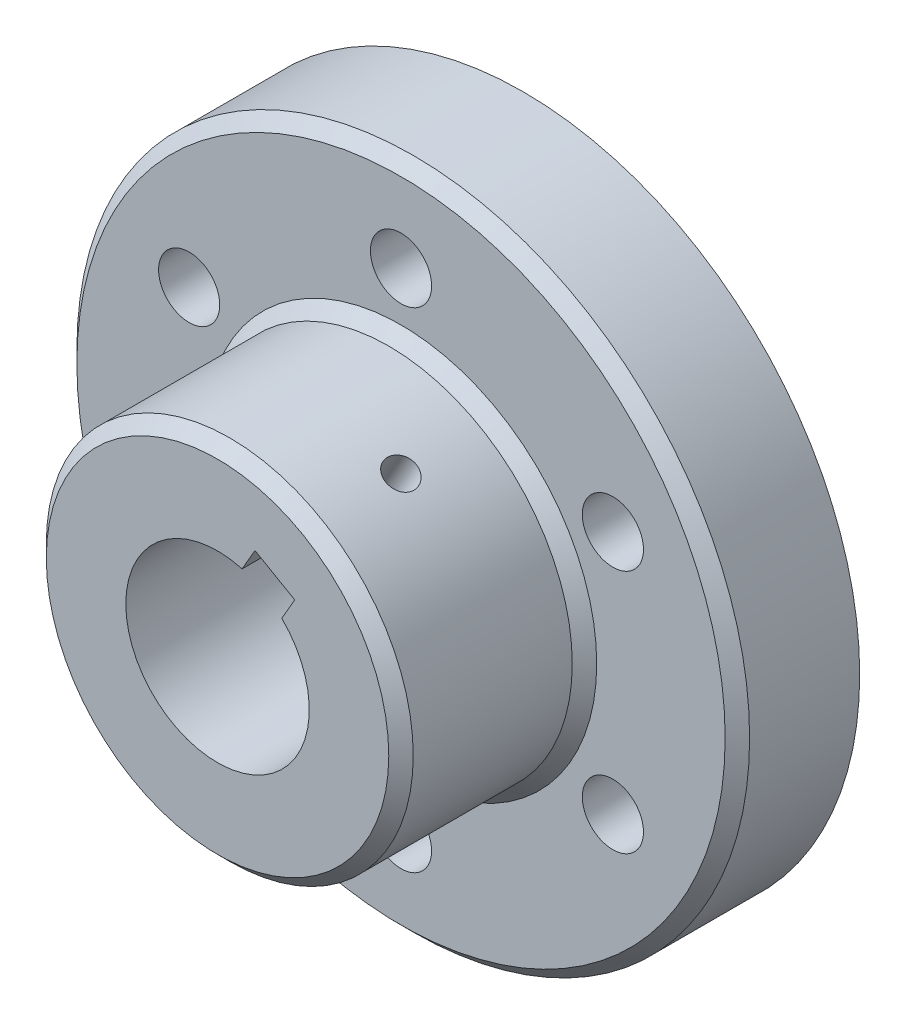
ISO-10303-21;
HEADER;
FILE_DESCRIPTION(('STEP AP214'),'2;1');
FILE_NAME('part.step','',(''),(''),'','','');
FILE_SCHEMA(('AUTOMOTIVE_DESIGN { 1 0 10303 214 1 1 1 1 }'));
ENDSEC;
DATA;
#1=APPLICATION_CONTEXT('core data for automotive mechanical design processes');
#2=APPLICATION_PROTOCOL_DEFINITION('international standard','automotive_design',2000,#1);
#3=PRODUCT_CONTEXT('',#1,'mechanical');
#4=PRODUCT('Part','Part','',(#3));
#5=PRODUCT_RELATED_PRODUCT_CATEGORY('part','',(#4));
#6=PRODUCT_DEFINITION_FORMATION('','',#4);
#7=PRODUCT_DEFINITION_CONTEXT('part definition',#1,'design');
#8=PRODUCT_DEFINITION('design','',#6,#7);
#9=PRODUCT_DEFINITION_SHAPE('','',#8);
#10=(LENGTH_UNIT() NAMED_UNIT(*) SI_UNIT(.MILLI.,.METRE.));
#11=(NAMED_UNIT(*) PLANE_ANGLE_UNIT() SI_UNIT($,.RADIAN.));
#12=(NAMED_UNIT(*) SI_UNIT($,.STERADIAN.) SOLID_ANGLE_UNIT());
#13=UNCERTAINTY_MEASURE_WITH_UNIT(LENGTH_MEASURE(1.E-05),#10,'distance_accuracy_value','');
#14=(GEOMETRIC_REPRESENTATION_CONTEXT(3) GLOBAL_UNCERTAINTY_ASSIGNED_CONTEXT((#13)) GLOBAL_UNIT_ASSIGNED_CONTEXT((#10,
#11,#12)) REPRESENTATION_CONTEXT('',''));
#15=CARTESIAN_POINT('',(0.,0.,0.));
#16=DIRECTION('',(0.,0.,1.));
#17=DIRECTION('',(1.,0.,0.));
#18=AXIS2_PLACEMENT_3D('',#15,#16,#17);
#19=CARTESIAN_POINT('',(0.,0.,12.7));
#20=DIRECTION('',(0.,0.,1.));
#21=DIRECTION('',(1.,0.,0.));
#22=AXIS2_PLACEMENT_3D('',#19,#20,#21);
#23=PLANE('',#22);
#24=CARTESIAN_POINT('',(0.,0.,12.7));
#25=DIRECTION('',(0.,0.,1.));
#26=DIRECTION('',(1.,0.,0.));
#27=AXIS2_PLACEMENT_3D('',#24,#25,#26);
#28=CIRCLE('',#27,20.32);
#29=CARTESIAN_POINT('',(-20.32,0.,12.7));
#30=VERTEX_POINT('',#29);
#31=EDGE_CURVE('E166',#30,#30,#28,.F.);
#32=ORIENTED_EDGE('',*,*,#31,.T.);
#33=EDGE_LOOP('',(#32));
#34=FACE_BOUND('',#33,.T.);
#35=CARTESIAN_POINT('',(0.,0.,12.7));
#36=DIRECTION('',(0.,0.,1.));
#37=DIRECTION('',(1.,0.,0.));
#38=AXIS2_PLACEMENT_3D('',#35,#36,#37);
#39=CIRCLE('',#38,33.655);
#40=CARTESIAN_POINT('',(33.655,0.,12.7));
#41=VERTEX_POINT('',#40);
#42=EDGE_CURVE('E163',#41,#41,#39,.T.);
#43=ORIENTED_EDGE('',*,*,#42,.T.);
#44=EDGE_LOOP('',(#43));
#45=FACE_BOUND('',#44,.T.);
#46=CARTESIAN_POINT('',(-21.9970452561246,12.7000000000003,12.7));
#47=DIRECTION('',(0.,0.,1.));
#48=DIRECTION('',(1.,0.,0.));
#49=AXIS2_PLACEMENT_3D('',#46,#47,#48);
#50=CIRCLE('',#49,3.175);
#51=CARTESIAN_POINT('',(-18.8220452561246,12.7000000000003,12.7));
#52=VERTEX_POINT('',#51);
#53=EDGE_CURVE('E114',#52,#52,#50,.T.);
#54=ORIENTED_EDGE('',*,*,#53,.F.);
#55=EDGE_LOOP('',(#54));
#56=FACE_BOUND('',#55,.T.);
#57=CARTESIAN_POINT('',(-21.9970452561249,-12.6999999999998,12.7));
#58=DIRECTION('',(0.,0.,1.));
#59=DIRECTION('',(1.,0.,0.));
#60=AXIS2_PLACEMENT_3D('',#57,#58,#59);
#61=CIRCLE('',#60,3.175);
#62=CARTESIAN_POINT('',(-18.8220452561249,-12.6999999999998,12.7));
#63=VERTEX_POINT('',#62);
#64=EDGE_CURVE('E120',#63,#63,#61,.T.);
#65=ORIENTED_EDGE('',*,*,#64,.F.);
#66=EDGE_LOOP('',(#65));
#67=FACE_BOUND('',#66,.T.);
#68=CARTESIAN_POINT('',(-1.77367252013231E-13,-25.4,12.7));
#69=DIRECTION('',(0.,0.,1.));
#70=DIRECTION('',(1.,0.,0.));
#71=AXIS2_PLACEMENT_3D('',#68,#69,#70);
#72=CIRCLE('',#71,3.175);
#73=CARTESIAN_POINT('',(3.17499999999982,-25.4,12.7));
#74=VERTEX_POINT('',#73);
#75=EDGE_CURVE('E126',#74,#74,#72,.T.);
#76=ORIENTED_EDGE('',*,*,#75,.F.);
#77=EDGE_LOOP('',(#76));
#78=FACE_BOUND('',#77,.T.);
#79=CARTESIAN_POINT('',(21.9970452561247,-12.7000000000001,12.7));
#80=DIRECTION('',(0.,0.,1.));
#81=DIRECTION('',(1.,0.,0.));
#82=AXIS2_PLACEMENT_3D('',#79,#80,#81);
#83=CIRCLE('',#82,3.175);
#84=CARTESIAN_POINT('',(25.1720452561247,-12.7000000000001,12.7));
#85=VERTEX_POINT('',#84);
#86=EDGE_CURVE('E132',#85,#85,#83,.T.);
#87=ORIENTED_EDGE('',*,*,#86,.F.);
#88=EDGE_LOOP('',(#87));
#89=FACE_BOUND('',#88,.T.);
#90=CARTESIAN_POINT('',(21.9970452561248,12.6999999999999,12.7));
#91=DIRECTION('',(0.,0.,1.));
#92=DIRECTION('',(1.,0.,0.));
#93=AXIS2_PLACEMENT_3D('',#90,#91,#92);
#94=CIRCLE('',#93,3.175);
#95=CARTESIAN_POINT('',(25.1720452561248,12.6999999999999,12.7));
#96=VERTEX_POINT('',#95);
#97=EDGE_CURVE('E138',#96,#96,#94,.T.);
#98=ORIENTED_EDGE('',*,*,#97,.F.);
#99=EDGE_LOOP('',(#98));
#100=FACE_BOUND('',#99,.T.);
#101=CARTESIAN_POINT('',(0.,25.4,12.7));
#102=DIRECTION('',(0.,0.,1.));
#103=DIRECTION('',(1.,0.,0.));
#104=AXIS2_PLACEMENT_3D('',#101,#102,#103);
#105=CIRCLE('',#104,3.175);
#106=CARTESIAN_POINT('',(3.175,25.4,12.7));
#107=VERTEX_POINT('',#106);
#108=EDGE_CURVE('E148',#107,#107,#105,.T.);
#109=ORIENTED_EDGE('',*,*,#108,.F.);
#110=EDGE_LOOP('',(#109));
#111=FACE_BOUND('',#110,.T.);
#112=ADVANCED_FACE('F33',(#34,#45,#56,#67,#78,#89,#100,#111),#23,.T.);
#113=CARTESIAN_POINT('',(0.,0.,12.7));
#114=DIRECTION('',(0.,0.,-1.));
#115=DIRECTION('',(-1.,0.,0.));
#116=AXIS2_PLACEMENT_3D('',#113,#114,#115);
#117=CYLINDRICAL_SURFACE('',#116,34.925);
#118=CARTESIAN_POINT('',(0.,0.,11.43));
#119=DIRECTION('',(0.,0.,1.));
#120=DIRECTION('',(1.,0.,0.));
#121=AXIS2_PLACEMENT_3D('',#118,#119,#120);
#122=CIRCLE('',#121,34.925);
#123=CARTESIAN_POINT('',(34.925,0.,11.43));
#124=VERTEX_POINT('',#123);
#125=EDGE_CURVE('E11',#124,#124,#122,.F.);
#126=ORIENTED_EDGE('',*,*,#125,.T.);
#127=EDGE_LOOP('',(#126));
#128=FACE_BOUND('',#127,.T.);
#129=CARTESIAN_POINT('',(0.,0.,0.));
#130=DIRECTION('',(0.,0.,1.));
#131=DIRECTION('',(1.,0.,0.));
#132=AXIS2_PLACEMENT_3D('',#129,#130,#131);
#133=CIRCLE('',#132,34.925);
#134=CARTESIAN_POINT('',(34.925,0.,0.));
#135=VERTEX_POINT('',#134);
#136=EDGE_CURVE('E151',#135,#135,#133,.T.);
#137=ORIENTED_EDGE('',*,*,#136,.T.);
#138=EDGE_LOOP('',(#137));
#139=FACE_BOUND('',#138,.T.);
#140=ADVANCED_FACE('F186',(#128,#139),#117,.T.);
#141=CARTESIAN_POINT('',(0.,0.,0.));
#142=DIRECTION('',(0.,0.,1.));
#143=DIRECTION('',(1.,0.,0.));
#144=AXIS2_PLACEMENT_3D('',#141,#142,#143);
#145=PLANE('',#144);
#146=CARTESIAN_POINT('',(-21.9970452561246,12.7000000000003,0.));
#147=DIRECTION('',(0.,0.,-1.));
#148=DIRECTION('',(-0.50000000000001,-0.866025403784433,0.));
#149=AXIS2_PLACEMENT_3D('',#146,#147,#148);
#150=CIRCLE('',#149,3.175);
#151=CARTESIAN_POINT('',(-23.5845452561246,9.95036934298468,0.));
#152=VERTEX_POINT('',#151);
#153=EDGE_CURVE('E110',#152,#152,#150,.T.);
#154=ORIENTED_EDGE('',*,*,#153,.F.);
#155=EDGE_LOOP('',(#154));
#156=FACE_BOUND('',#155,.T.);
#157=CARTESIAN_POINT('',(-21.9970452561249,-12.6999999999998,0.));
#158=DIRECTION('',(0.,0.,-1.));
#159=DIRECTION('',(0.499999999999992,-0.866025403784443,0.));
#160=AXIS2_PLACEMENT_3D('',#157,#158,#159);
#161=CIRCLE('',#160,3.175);
#162=CARTESIAN_POINT('',(-20.4095452561249,-15.4496306570154,0.));
#163=VERTEX_POINT('',#162);
#164=EDGE_CURVE('E117',#163,#163,#161,.T.);
#165=ORIENTED_EDGE('',*,*,#164,.F.);
#166=EDGE_LOOP('',(#165));
#167=FACE_BOUND('',#166,.T.);
#168=CARTESIAN_POINT('',(-1.77367252013231E-13,-25.4,0.));
#169=DIRECTION('',(0.,0.,-1.));
#170=DIRECTION('',(1.,0.,0.));
#171=AXIS2_PLACEMENT_3D('',#168,#169,#170);
#172=CIRCLE('',#171,3.175);
#173=CARTESIAN_POINT('',(3.17499999999982,-25.4,0.));
#174=VERTEX_POINT('',#173);
#175=EDGE_CURVE('E123',#174,#174,#172,.T.);
#176=ORIENTED_EDGE('',*,*,#175,.F.);
#177=EDGE_LOOP('',(#176));
#178=FACE_BOUND('',#177,.T.);
#179=CARTESIAN_POINT('',(21.9970452561247,-12.7000000000001,0.));
#180=DIRECTION('',(0.,0.,-1.));
#181=DIRECTION('',(0.500000000000004,0.866025403784436,0.));
#182=AXIS2_PLACEMENT_3D('',#179,#180,#181);
#183=CIRCLE('',#182,3.175);
#184=CARTESIAN_POINT('',(23.5845452561247,-9.95036934298452,0.));
#185=VERTEX_POINT('',#184);
#186=EDGE_CURVE('E129',#185,#185,#183,.T.);
#187=ORIENTED_EDGE('',*,*,#186,.F.);
#188=EDGE_LOOP('',(#187));
#189=FACE_BOUND('',#188,.T.);
#190=CARTESIAN_POINT('',(21.9970452561248,12.6999999999999,0.));
#191=DIRECTION('',(0.,0.,-1.));
#192=DIRECTION('',(-0.499999999999998,0.86602540378444,0.));
#193=AXIS2_PLACEMENT_3D('',#190,#191,#192);
#194=CIRCLE('',#193,3.175);
#195=CARTESIAN_POINT('',(20.4095452561248,15.4496306570155,0.));
#196=VERTEX_POINT('',#195);
#197=EDGE_CURVE('E135',#196,#196,#194,.T.);
#198=ORIENTED_EDGE('',*,*,#197,.F.);
#199=EDGE_LOOP('',(#198));
#200=FACE_BOUND('',#199,.T.);
#201=DIRECTION('',(0.86602540378444,-0.499999999999998,0.));
#202=VECTOR('',#201,1.);
#203=CARTESIAN_POINT('',(3.89090200723829,11.5017399638085,0.));
#204=LINE('',#203,#202);
#205=CARTESIAN_POINT('',(3.89090200723829,11.5017399638085,0.));
#206=VERTEX_POINT('',#205);
#207=CARTESIAN_POINT('',(8.01534799276168,9.12048996380849,0.));
#208=VERTEX_POINT('',#207);
#209=EDGE_CURVE('E96',#206,#208,#204,.T.);
#210=ORIENTED_EDGE('',*,*,#209,.F.);
#211=DIRECTION('',(0.499999999999999,0.866025403784439,0.));
#212=VECTOR('',#211,1.);
#213=CARTESIAN_POINT('',(1.50965200723829,7.37729397828509,0.));
#214=LINE('',#213,#212);
#215=CARTESIAN_POINT('',(2.54904780381649,9.17758030713206,0.));
#216=VERTEX_POINT('',#215);
#217=EDGE_CURVE('E79',#216,#206,#214,.T.);
#218=ORIENTED_EDGE('',*,*,#217,.F.);
#219=CARTESIAN_POINT('',(0.,0.,0.));
#220=DIRECTION('',(0.,0.,-1.));
#221=DIRECTION('',(-1.,0.,0.));
#222=AXIS2_PLACEMENT_3D('',#219,#220,#221);
#223=CIRCLE('',#222,9.525);
#224=CARTESIAN_POINT('',(6.67349378933989,6.79633030713207,0.));
#225=VERTEX_POINT('',#224);
#226=EDGE_CURVE('E141',#225,#216,#223,.T.);
#227=ORIENTED_EDGE('',*,*,#226,.F.);
#228=DIRECTION('',(-0.499999999999998,-0.86602540378444,0.));
#229=VECTOR('',#228,1.);
#230=CARTESIAN_POINT('',(5.63409799276169,4.99604397828509,0.));
#231=LINE('',#230,#229);
#232=EDGE_CURVE('E48',#208,#225,#231,.T.);
#233=ORIENTED_EDGE('',*,*,#232,.F.);
#234=EDGE_LOOP('',(#210,#218,#227,#233));
#235=FACE_BOUND('',#234,.T.);
#236=CARTESIAN_POINT('',(0.,25.4,0.));
#237=DIRECTION('',(0.,0.,-1.));
#238=DIRECTION('',(-1.,0.,0.));
#239=AXIS2_PLACEMENT_3D('',#236,#237,#238);
#240=CIRCLE('',#239,3.175);
#241=CARTESIAN_POINT('',(-3.175,25.4,0.));
#242=VERTEX_POINT('',#241);
#243=EDGE_CURVE('E143',#242,#242,#240,.T.);
#244=ORIENTED_EDGE('',*,*,#243,.F.);
#245=EDGE_LOOP('',(#244));
#246=FACE_BOUND('',#245,.T.);
#247=ORIENTED_EDGE('',*,*,#136,.F.);
#248=EDGE_LOOP('',(#247));
#249=FACE_BOUND('',#248,.T.);
#250=ADVANCED_FACE('F192',(#156,#167,#178,#189,#200,#235,#246,#249),#145,.F.);
#251=CARTESIAN_POINT('',(0.,0.,31.75));
#252=DIRECTION('',(0.,0.,-1.));
#253=DIRECTION('',(-1.,0.,0.));
#254=AXIS2_PLACEMENT_3D('',#251,#252,#253);
#255=CYLINDRICAL_SURFACE('',#254,19.05);
#256=CARTESIAN_POINT('',(0.,0.,13.9700000000001));
#257=DIRECTION('',(0.,0.,1.));
#258=DIRECTION('',(1.,0.,0.));
#259=AXIS2_PLACEMENT_3D('',#256,#257,#258);
#260=CIRCLE('',#259,19.05);
#261=CARTESIAN_POINT('',(-19.05,0.,13.9700000000001));
#262=VERTEX_POINT('',#261);
#263=EDGE_CURVE('E160',#262,#262,#260,.T.);
#264=ORIENTED_EDGE('',*,*,#263,.T.);
#265=EDGE_LOOP('',(#264));
#266=FACE_BOUND('',#265,.T.);
#267=CARTESIAN_POINT('',(0.,0.,30.4800000000001));
#268=DIRECTION('',(0.,0.,1.));
#269=DIRECTION('',(1.,0.,0.));
#270=AXIS2_PLACEMENT_3D('',#267,#268,#269);
#271=CIRCLE('',#270,19.05);
#272=CARTESIAN_POINT('',(19.05,0.,30.4800000000001));
#273=VERTEX_POINT('',#272);
#274=EDGE_CURVE('E157',#273,#273,#271,.F.);
#275=ORIENTED_EDGE('',*,*,#274,.T.);
#276=EDGE_LOOP('',(#275));
#277=FACE_BOUND('',#276,.T.);
#278=CARTESIAN_POINT('',(10.8666847933445,15.6466501719088,22.225));
#279=CARTESIAN_POINT('',(10.8666818651182,15.6466528761857,22.3140043127048));
#280=CARTESIAN_POINT('',(10.8604970069784,15.650953244564,22.4030692180253));
#281=CARTESIAN_POINT('',(10.8358894007108,15.6679997536673,22.5787347197952));
#282=CARTESIAN_POINT('',(10.8174527860029,15.6807554641364,22.6653324078901));
#283=CARTESIAN_POINT('',(10.7688009398026,15.714206712792,22.833493823849));
#284=CARTESIAN_POINT('',(10.7385923858706,15.734897749608,22.915060375266));
#285=CARTESIAN_POINT('',(10.6671475712465,15.7834190977927,23.0708885723957));
#286=CARTESIAN_POINT('',(10.6259136681267,15.8112478828307,23.1451517751599));
#287=CARTESIAN_POINT('',(10.5333276263767,15.8730780183991,23.2844752798683));
#288=CARTESIAN_POINT('',(10.4819526688781,15.9070932755781,23.3495142480825));
#289=CARTESIAN_POINT('',(10.3704299935362,15.9800222619943,23.4683597914029));
#290=CARTESIAN_POINT('',(10.3102818926064,16.0189362051264,23.5221658757665));
#291=CARTESIAN_POINT('',(10.182660313122,16.1003620396873,23.6170892507667));
#292=CARTESIAN_POINT('',(10.1151763693099,16.1428790516652,23.6581880835506));
#293=CARTESIAN_POINT('',(9.97473577291482,16.2300329291798,23.7264122421506));
#294=CARTESIAN_POINT('',(9.90177921614819,16.274669757597,23.7535378125497));
#295=CARTESIAN_POINT('',(9.75255423170922,16.364527180757,23.7929840431215));
#296=CARTESIAN_POINT('',(9.67629395818589,16.4097461640122,23.8053392179021));
#297=CARTESIAN_POINT('',(9.52243367641348,16.4995056842533,23.8150006350555));
#298=CARTESIAN_POINT('',(9.44483369310488,16.5440462338402,23.8123071572785));
#299=CARTESIAN_POINT('',(9.29071010806454,16.6310859966338,23.7919759551652));
#300=CARTESIAN_POINT('',(9.21418431245311,16.673590002953,23.7743753464358));
#301=CARTESIAN_POINT('',(9.06423942100082,16.75557728882,23.7247872103477));
#302=CARTESIAN_POINT('',(8.99082035472627,16.7950605396224,23.692799546103));
#303=CARTESIAN_POINT('',(8.84917393130811,16.8701233140618,23.6153039454493));
#304=CARTESIAN_POINT('',(8.78095308740019,16.9056979641982,23.5697793865745));
#305=CARTESIAN_POINT('',(8.65185466362476,16.9721297985105,23.4665143419939));
#306=CARTESIAN_POINT('',(8.59097723274782,17.0029868869751,23.4087736084996));
#307=CARTESIAN_POINT('',(8.47825517286101,17.0594749321115,23.282506076571));
#308=CARTESIAN_POINT('',(8.42643856175028,17.0850897187206,23.2139470270251));
#309=CARTESIAN_POINT('',(8.33368820268253,17.1305229580632,23.0681013981278));
#310=CARTESIAN_POINT('',(8.29275446369665,17.1503414060184,22.9908148115821));
#311=CARTESIAN_POINT('',(8.223072704113,17.1838609724402,22.8296852781623));
#312=CARTESIAN_POINT('',(8.19432618652879,17.1975613363927,22.7458415241218));
#313=CARTESIAN_POINT('',(8.14996297165757,17.2186297940315,22.573988510094));
#314=CARTESIAN_POINT('',(8.13434599833628,17.2259980208441,22.4859793377212));
#315=CARTESIAN_POINT('',(8.11678303725333,17.2342806352836,22.3085768163435));
#316=CARTESIAN_POINT('',(8.1147961160244,17.2352143469412,22.2191884205531));
#317=CARTESIAN_POINT('',(8.12445023902665,17.2306655610766,22.0413161794562));
#318=CARTESIAN_POINT('',(8.13609115614567,17.2251831234004,21.9528323257205));
#319=CARTESIAN_POINT('',(8.17259104110522,17.2078952316214,21.7794104101682));
#320=CARTESIAN_POINT('',(8.1974309604465,17.196098889423,21.6944674282836));
#321=CARTESIAN_POINT('',(8.25951163584332,17.1663666855668,21.5303860695651));
#322=CARTESIAN_POINT('',(8.29675259087796,17.1484307253963,21.4512477858945));
#323=CARTESIAN_POINT('',(8.38255146329192,17.1066538058157,21.3008158371019));
#324=CARTESIAN_POINT('',(8.4311360525673,17.0827989210223,21.2295412524175));
#325=CARTESIAN_POINT('',(8.53805017172349,17.0296140527166,21.0970527688104));
#326=CARTESIAN_POINT('',(8.5963798692898,17.0002839749907,21.0358390430423));
#327=CARTESIAN_POINT('',(8.7211441737376,16.9366186680417,20.9250559308401));
#328=CARTESIAN_POINT('',(8.78759855850997,16.9022711837596,20.8755158546075));
#329=CARTESIAN_POINT('',(8.92647354992522,16.829340834346,20.7896874122163));
#330=CARTESIAN_POINT('',(8.99889409693955,16.7907580115431,20.7533989136349));
#331=CARTESIAN_POINT('',(9.14743517862935,16.7102977009143,20.6951540591645));
#332=CARTESIAN_POINT('',(9.22355090248331,16.6684244552019,20.673179578206));
#333=CARTESIAN_POINT('',(9.37732332043211,16.5824022735245,20.6441272953654));
#334=CARTESIAN_POINT('',(9.45497998533078,16.5382533806509,20.6370492115131));
#335=CARTESIAN_POINT('',(9.60935465787154,16.4490342417252,20.6379939341166));
#336=CARTESIAN_POINT('',(9.68607479631987,16.4039671917673,20.6459710616687));
#337=CARTESIAN_POINT('',(9.83666417348813,16.3141113446793,20.6767045102871));
#338=CARTESIAN_POINT('',(9.91053340833575,16.2693225479272,20.6994608514268));
#339=CARTESIAN_POINT('',(10.0534043547463,16.18142765898,20.7590951500693));
#340=CARTESIAN_POINT('',(10.1224063488698,16.1383214691685,20.7959722870092));
#341=CARTESIAN_POINT('',(10.2537256509161,16.0552065253046,20.8827961270688));
#342=CARTESIAN_POINT('',(10.3160430645279,16.0151977222827,20.9327426235077));
#343=CARTESIAN_POINT('',(10.4325667047752,15.9395389020964,21.0444588235729));
#344=CARTESIAN_POINT('',(10.4867489347097,15.9039018348848,21.1062623266126));
#345=CARTESIAN_POINT('',(10.5854320526674,15.8383915359616,21.2398771428525));
#346=CARTESIAN_POINT('',(10.6299305928491,15.8085197022474,21.3116908761566));
#347=CARTESIAN_POINT('',(10.7081957727157,15.7556112574801,21.4634270386128));
#348=CARTESIAN_POINT('',(10.7419421471634,15.7325875588719,21.543364409377));
#349=CARTESIAN_POINT('',(10.7977218903268,15.69435745958,21.7089155558162));
#350=CARTESIAN_POINT('',(10.8197687257069,15.679142071868,21.7945226770874));
#351=CARTESIAN_POINT('',(10.8460025589197,15.6609985299017,21.9380290287107));
#352=CARTESIAN_POINT('',(10.8537493642314,15.6556272608318,21.995005306286));
#353=CARTESIAN_POINT('',(10.8640914235137,15.6484522102155,22.1096459050401));
#354=CARTESIAN_POINT('',(10.866686691328,15.6466484190823,22.1673102243695));
#355=CARTESIAN_POINT('',(10.8666847933445,15.6466501719088,22.225));
#356=B_SPLINE_CURVE_WITH_KNOTS('',3,(#278,#279,#280,#281,#282,#283,#284,#285,#286,#287,#288,
#289,#290,#291,#292,#293,#294,#295,#296,#297,#298,#299,#300,#301,#302,#303,#304,#305,#306,#307,
#308,#309,#310,#311,#312,#313,#314,#315,#316,#317,#318,#319,#320,#321,#322,#323,#324,#325,#326,
#327,#328,#329,#330,#331,#332,#333,#334,#335,#336,#337,#338,#339,#340,#341,#342,#343,#344,#345,
#346,#347,#348,#349,#350,#351,#352,#353,#354,#355),.UNSPECIFIED.,.T.,.F.,(4,2,2,2,2,2,2,2,2,2,2,
2,2,2,2,2,2,2,2,2,2,2,2,2,2,2,2,2,2,2,2,2,2,2,2,2,2,2,4),(0.,0.26680230175532,0.533907086738514,
0.800860578198794,1.06775703205188,1.33526103262815,1.60277671748278,1.870679174885,
2.13857694286197,2.40584747147461,2.67311302984441,2.93971510297935,3.20631971276011,
3.47325305794096,3.74019181802418,4.00794194636204,4.27569229541547,4.54347565571975,
4.8112533860313,5.07822657882477,5.3451972814749,5.61178374037068,5.87837447694841,
6.14559846638271,6.41282705445238,6.68071961632462,6.94860950108096,7.21615950848593,
7.4837044514587,7.75043894310614,8.01717379704019,8.28389315330116,8.55060829187645,
8.81809533563863,9.08564716041592,9.35370031305213,9.62144425223722,9.79437751603814,
9.96731031511524),.UNSPECIFIED.);
#357=CARTESIAN_POINT('',(10.8666847933445,15.6466501719088,22.225));
#358=VERTEX_POINT('',#357);
#359=EDGE_CURVE('E99',#358,#358,#356,.T.);
#360=ORIENTED_EDGE('',*,*,#359,.T.);
#361=EDGE_LOOP('',(#360));
#362=FACE_BOUND('',#361,.T.);
#363=ADVANCED_FACE('F197',(#266,#277,#362),#255,.T.);
#364=CARTESIAN_POINT('',(0.,0.,31.75));
#365=DIRECTION('',(0.,0.,1.));
#366=DIRECTION('',(1.,0.,0.));
#367=AXIS2_PLACEMENT_3D('',#364,#365,#366);
#368=PLANE('',#367);
#369=CARTESIAN_POINT('',(0.,0.,31.75));
#370=DIRECTION('',(0.,0.,1.));
#371=DIRECTION('',(1.,0.,0.));
#372=AXIS2_PLACEMENT_3D('',#369,#370,#371);
#373=CIRCLE('',#372,17.7800000000001);
#374=CARTESIAN_POINT('',(17.7800000000001,0.,31.75));
#375=VERTEX_POINT('',#374);
#376=EDGE_CURVE('E41',#375,#375,#373,.T.);
#377=ORIENTED_EDGE('',*,*,#376,.T.);
#378=EDGE_LOOP('',(#377));
#379=FACE_BOUND('',#378,.T.);
#380=DIRECTION('',(0.499999999999999,0.866025403784439,0.));
#381=VECTOR('',#380,1.);
#382=CARTESIAN_POINT('',(1.50965200723829,7.37729397828509,31.75));
#383=LINE('',#382,#381);
#384=CARTESIAN_POINT('',(2.54904780381649,9.17758030713206,31.75));
#385=VERTEX_POINT('',#384);
#386=CARTESIAN_POINT('',(3.89090200723829,11.5017399638085,31.75));
#387=VERTEX_POINT('',#386);
#388=EDGE_CURVE('E76',#385,#387,#383,.T.);
#389=ORIENTED_EDGE('',*,*,#388,.T.);
#390=DIRECTION('',(0.86602540378444,-0.499999999999998,0.));
#391=VECTOR('',#390,1.);
#392=CARTESIAN_POINT('',(3.89090200723829,11.5017399638085,31.75));
#393=LINE('',#392,#391);
#394=CARTESIAN_POINT('',(8.01534799276168,9.12048996380849,31.75));
#395=VERTEX_POINT('',#394);
#396=EDGE_CURVE('E87',#387,#395,#393,.T.);
#397=ORIENTED_EDGE('',*,*,#396,.T.);
#398=DIRECTION('',(-0.499999999999998,-0.86602540378444,0.));
#399=VECTOR('',#398,1.);
#400=CARTESIAN_POINT('',(5.63409799276169,4.99604397828509,31.75));
#401=LINE('',#400,#399);
#402=CARTESIAN_POINT('',(6.67349378933989,6.79633030713207,31.75));
#403=VERTEX_POINT('',#402);
#404=EDGE_CURVE('E84',#395,#403,#401,.T.);
#405=ORIENTED_EDGE('',*,*,#404,.T.);
#406=CARTESIAN_POINT('',(0.,0.,31.75));
#407=DIRECTION('',(0.,0.,-1.));
#408=DIRECTION('',(-1.,0.,0.));
#409=AXIS2_PLACEMENT_3D('',#406,#407,#408);
#410=CIRCLE('',#409,9.525);
#411=EDGE_CURVE('E94',#403,#385,#410,.T.);
#412=ORIENTED_EDGE('',*,*,#411,.T.);
#413=EDGE_LOOP('',(#389,#397,#405,#412));
#414=FACE_BOUND('',#413,.T.);
#415=ADVANCED_FACE('F92',(#379,#414),#368,.T.);
#416=CARTESIAN_POINT('',(0.,25.4,31.75));
#417=DIRECTION('',(0.,0.,-1.));
#418=DIRECTION('',(-1.,0.,0.));
#419=AXIS2_PLACEMENT_3D('',#416,#417,#418);
#420=CYLINDRICAL_SURFACE('',#419,3.175);
#421=ORIENTED_EDGE('',*,*,#108,.T.);
#422=EDGE_LOOP('',(#421));
#423=FACE_BOUND('',#422,.T.);
#424=ORIENTED_EDGE('',*,*,#243,.T.);
#425=EDGE_LOOP('',(#424));
#426=FACE_BOUND('',#425,.T.);
#427=ADVANCED_FACE('F222',(#423,#426),#420,.F.);
#428=CARTESIAN_POINT('',(0.,0.,31.75));
#429=DIRECTION('',(0.,0.,-1.));
#430=DIRECTION('',(-1.,0.,0.));
#431=AXIS2_PLACEMENT_3D('',#428,#429,#430);
#432=CYLINDRICAL_SURFACE('',#431,9.525);
#433=ORIENTED_EDGE('',*,*,#226,.T.);
#434=DIRECTION('',(0.,0.,-1.));
#435=VECTOR('',#434,1.);
#436=CARTESIAN_POINT('',(2.54904780381649,9.17758030713207,31.75));
#437=LINE('',#436,#435);
#438=EDGE_CURVE('E155',#216,#385,#437,.F.);
#439=ORIENTED_EDGE('',*,*,#438,.T.);
#440=ORIENTED_EDGE('',*,*,#411,.F.);
#441=DIRECTION('',(0.,0.,-1.));
#442=VECTOR('',#441,1.);
#443=CARTESIAN_POINT('',(6.67349378933989,6.79633030713207,31.75));
#444=LINE('',#443,#442);
#445=EDGE_CURVE('E52',#403,#225,#444,.T.);
#446=ORIENTED_EDGE('',*,*,#445,.T.);
#447=EDGE_LOOP('',(#433,#439,#440,#446));
#448=FACE_BOUND('',#447,.T.);
#449=ADVANCED_FACE('F224',(#448),#432,.F.);
#450=CARTESIAN_POINT('',(21.9970452561248,12.6999999999999,31.75));
#451=DIRECTION('',(0.,0.,-1.));
#452=DIRECTION('',(-1.,0.,0.));
#453=AXIS2_PLACEMENT_3D('',#450,#451,#452);
#454=CYLINDRICAL_SURFACE('',#453,3.175);
#455=ORIENTED_EDGE('',*,*,#97,.T.);
#456=EDGE_LOOP('',(#455));
#457=FACE_BOUND('',#456,.T.);
#458=ORIENTED_EDGE('',*,*,#197,.T.);
#459=EDGE_LOOP('',(#458));
#460=FACE_BOUND('',#459,.T.);
#461=ADVANCED_FACE('F231',(#457,#460),#454,.F.);
#462=CARTESIAN_POINT('',(21.9970452561247,-12.7000000000001,31.75));
#463=DIRECTION('',(0.,0.,-1.));
#464=DIRECTION('',(-1.,0.,0.));
#465=AXIS2_PLACEMENT_3D('',#462,#463,#464);
#466=CYLINDRICAL_SURFACE('',#465,3.175);
#467=ORIENTED_EDGE('',*,*,#86,.T.);
#468=EDGE_LOOP('',(#467));
#469=FACE_BOUND('',#468,.T.);
#470=ORIENTED_EDGE('',*,*,#186,.T.);
#471=EDGE_LOOP('',(#470));
#472=FACE_BOUND('',#471,.T.);
#473=ADVANCED_FACE('F237',(#469,#472),#466,.F.);
#474=CARTESIAN_POINT('',(-1.77367252013231E-13,-25.4,31.75));
#475=DIRECTION('',(0.,0.,-1.));
#476=DIRECTION('',(-1.,0.,0.));
#477=AXIS2_PLACEMENT_3D('',#474,#475,#476);
#478=CYLINDRICAL_SURFACE('',#477,3.175);
#479=ORIENTED_EDGE('',*,*,#75,.T.);
#480=EDGE_LOOP('',(#479));
#481=FACE_BOUND('',#480,.T.);
#482=ORIENTED_EDGE('',*,*,#175,.T.);
#483=EDGE_LOOP('',(#482));
#484=FACE_BOUND('',#483,.T.);
#485=ADVANCED_FACE('F241',(#481,#484),#478,.F.);
#486=CARTESIAN_POINT('',(-21.9970452561249,-12.6999999999998,31.75));
#487=DIRECTION('',(0.,0.,-1.));
#488=DIRECTION('',(-1.,0.,0.));
#489=AXIS2_PLACEMENT_3D('',#486,#487,#488);
#490=CYLINDRICAL_SURFACE('',#489,3.175);
#491=ORIENTED_EDGE('',*,*,#64,.T.);
#492=EDGE_LOOP('',(#491));
#493=FACE_BOUND('',#492,.T.);
#494=ORIENTED_EDGE('',*,*,#164,.T.);
#495=EDGE_LOOP('',(#494));
#496=FACE_BOUND('',#495,.T.);
#497=ADVANCED_FACE('F245',(#493,#496),#490,.F.);
#498=CARTESIAN_POINT('',(-21.9970452561246,12.7000000000003,31.75));
#499=DIRECTION('',(0.,0.,-1.));
#500=DIRECTION('',(-1.,0.,0.));
#501=AXIS2_PLACEMENT_3D('',#498,#499,#500);
#502=CYLINDRICAL_SURFACE('',#501,3.175);
#503=ORIENTED_EDGE('',*,*,#53,.T.);
#504=EDGE_LOOP('',(#503));
#505=FACE_BOUND('',#504,.T.);
#506=ORIENTED_EDGE('',*,*,#153,.T.);
#507=EDGE_LOOP('',(#506));
#508=FACE_BOUND('',#507,.T.);
#509=ADVANCED_FACE('F249',(#505,#508),#502,.F.);
#510=CARTESIAN_POINT('',(1.50965200723829,7.37729397828509,31.75));
#511=DIRECTION('',(-0.866025403784439,0.499999999999999,0.));
#512=DIRECTION('',(-0.499999999999999,-0.866025403784439,0.));
#513=AXIS2_PLACEMENT_3D('',#510,#511,#512);
#514=PLANE('',#513);
#515=ORIENTED_EDGE('',*,*,#217,.T.);
#516=DIRECTION('',(0.,0.,-1.));
#517=VECTOR('',#516,1.);
#518=CARTESIAN_POINT('',(3.89090200723829,11.5017399638085,31.75));
#519=LINE('',#518,#517);
#520=EDGE_CURVE('E72',#387,#206,#519,.T.);
#521=ORIENTED_EDGE('',*,*,#520,.F.);
#522=ORIENTED_EDGE('',*,*,#388,.F.);
#523=ORIENTED_EDGE('',*,*,#438,.F.);
#524=EDGE_LOOP('',(#515,#521,#522,#523));
#525=FACE_BOUND('',#524,.T.);
#526=ADVANCED_FACE('F74',(#525),#514,.F.);
#527=CARTESIAN_POINT('',(5.63409799276169,4.99604397828509,31.75));
#528=DIRECTION('',(0.86602540378444,-0.499999999999998,0.));
#529=DIRECTION('',(0.499999999999998,0.86602540378444,0.));
#530=AXIS2_PLACEMENT_3D('',#527,#528,#529);
#531=PLANE('',#530);
#532=ORIENTED_EDGE('',*,*,#404,.F.);
#533=DIRECTION('',(0.,0.,-1.));
#534=VECTOR('',#533,1.);
#535=CARTESIAN_POINT('',(8.01534799276168,9.12048996380849,31.75));
#536=LINE('',#535,#534);
#537=EDGE_CURVE('E83',#395,#208,#536,.T.);
#538=ORIENTED_EDGE('',*,*,#537,.T.);
#539=ORIENTED_EDGE('',*,*,#232,.T.);
#540=ORIENTED_EDGE('',*,*,#445,.F.);
#541=EDGE_LOOP('',(#532,#538,#539,#540));
#542=FACE_BOUND('',#541,.T.);
#543=ADVANCED_FACE('F256',(#542),#531,.F.);
#544=CARTESIAN_POINT('',(3.89090200723829,11.5017399638085,31.75));
#545=DIRECTION('',(0.499999999999998,0.866025403784439,0.));
#546=DIRECTION('',(-0.86602540378444,0.499999999999999,0.));
#547=AXIS2_PLACEMENT_3D('',#544,#545,#546);
#548=PLANE('',#547);
#549=CARTESIAN_POINT('',(5.95312499999998,10.3111149638085,22.225));
#550=DIRECTION('',(-0.499999999999998,-0.86602540378444,0.));
#551=DIRECTION('',(0.86602540378444,-0.499999999999998,0.));
#552=AXIS2_PLACEMENT_3D('',#549,#550,#551);
#553=CIRCLE('',#552,1.5875);
#554=CARTESIAN_POINT('',(7.32794032850778,9.51736496380849,22.225));
#555=VERTEX_POINT('',#554);
#556=EDGE_CURVE('E269',#555,#555,#553,.T.);
#557=ORIENTED_EDGE('',*,*,#556,.F.);
#558=EDGE_LOOP('',(#557));
#559=FACE_BOUND('',#558,.T.);
#560=ORIENTED_EDGE('',*,*,#209,.T.);
#561=ORIENTED_EDGE('',*,*,#537,.F.);
#562=ORIENTED_EDGE('',*,*,#396,.F.);
#563=ORIENTED_EDGE('',*,*,#520,.T.);
#564=EDGE_LOOP('',(#560,#561,#562,#563));
#565=FACE_BOUND('',#564,.T.);
#566=ADVANCED_FACE('F88',(#559,#565),#548,.F.);
#567=CARTESIAN_POINT('',(23.8542186135857,41.3167186135858,22.225));
#568=DIRECTION('',(-0.499999999999998,-0.86602540378444,0.));
#569=DIRECTION('',(0.86602540378444,-0.499999999999998,0.));
#570=AXIS2_PLACEMENT_3D('',#567,#568,#569);
#571=CYLINDRICAL_SURFACE('',#570,1.5875);
#572=ORIENTED_EDGE('',*,*,#556,.T.);
#573=EDGE_LOOP('',(#572));
#574=FACE_BOUND('',#573,.T.);
#575=ORIENTED_EDGE('',*,*,#359,.F.);
#576=EDGE_LOOP('',(#575));
#577=FACE_BOUND('',#576,.T.);
#578=ADVANCED_FACE('F181',(#574,#577),#571,.F.);
#579=CARTESIAN_POINT('',(0.,0.,13.9700000000001));
#580=DIRECTION('',(0.,0.,-1.));
#581=DIRECTION('',(-1.,0.,0.));
#582=AXIS2_PLACEMENT_3D('',#579,#580,#581);
#583=CONICAL_SURFACE('',#582,19.05,0.785398163397443);
#584=CARTESIAN_POINT('',(-20.32,0.,12.7));
#585=CARTESIAN_POINT('',(-20.3067708333334,0.,12.7132291666667));
#586=CARTESIAN_POINT('',(-20.2935416666667,0.,12.7264583333333));
#587=CARTESIAN_POINT('',(-20.2670833333334,0.,12.7529166666667));
#588=CARTESIAN_POINT('',(-20.2538541666667,0.,12.7661458333333));
#589=CARTESIAN_POINT('',(-20.2273958333334,0.,12.7926041666667));
#590=CARTESIAN_POINT('',(-20.2141666666667,0.,12.8058333333333));
#591=CARTESIAN_POINT('',(-20.1877083333334,0.,12.8322916666667));
#592=CARTESIAN_POINT('',(-20.1744791666667,0.,12.8455208333333));
#593=CARTESIAN_POINT('',(-20.1480208333334,0.,12.8719791666667));
#594=CARTESIAN_POINT('',(-20.1347916666667,0.,12.8852083333333));
#595=CARTESIAN_POINT('',(-20.1083333333334,0.,12.9116666666667));
#596=CARTESIAN_POINT('',(-20.0951041666667,0.,12.9248958333333));
#597=CARTESIAN_POINT('',(-20.0686458333334,0.,12.9513541666667));
#598=CARTESIAN_POINT('',(-20.0554166666667,0.,12.9645833333333));
#599=CARTESIAN_POINT('',(-20.0289583333334,0.,12.9910416666667));
#600=CARTESIAN_POINT('',(-20.0157291666667,0.,13.0042708333333));
#601=CARTESIAN_POINT('',(-19.9892708333334,0.,13.0307291666667));
#602=CARTESIAN_POINT('',(-19.9760416666667,0.,13.0439583333333));
#603=CARTESIAN_POINT('',(-19.9495833333334,0.,13.0704166666667));
#604=CARTESIAN_POINT('',(-19.9363541666667,0.,13.0836458333333));
#605=CARTESIAN_POINT('',(-19.9098958333334,0.,13.1101041666667));
#606=CARTESIAN_POINT('',(-19.8966666666667,0.,13.1233333333333));
#607=CARTESIAN_POINT('',(-19.8702083333334,0.,13.1497916666667));
#608=CARTESIAN_POINT('',(-19.8569791666667,0.,13.1630208333334));
#609=CARTESIAN_POINT('',(-19.8305208333334,0.,13.1894791666667));
#610=CARTESIAN_POINT('',(-19.8172916666667,0.,13.2027083333334));
#611=CARTESIAN_POINT('',(-19.7908333333334,0.,13.2291666666667));
#612=CARTESIAN_POINT('',(-19.7776041666667,0.,13.2423958333334));
#613=CARTESIAN_POINT('',(-19.7511458333334,0.,13.2688541666667));
#614=CARTESIAN_POINT('',(-19.7379166666667,0.,13.2820833333334));
#615=CARTESIAN_POINT('',(-19.7114583333334,0.,13.3085416666667));
#616=CARTESIAN_POINT('',(-19.6982291666667,0.,13.3217708333334));
#617=CARTESIAN_POINT('',(-19.6717708333334,0.,13.3482291666667));
#618=CARTESIAN_POINT('',(-19.6585416666667,0.,13.3614583333334));
#619=CARTESIAN_POINT('',(-19.6320833333334,0.,13.3879166666667));
#620=CARTESIAN_POINT('',(-19.6188541666667,0.,13.4011458333334));
#621=CARTESIAN_POINT('',(-19.5923958333334,0.,13.4276041666667));
#622=CARTESIAN_POINT('',(-19.5791666666667,0.,13.4408333333334));
#623=CARTESIAN_POINT('',(-19.5527083333333,0.,13.4672916666667));
#624=CARTESIAN_POINT('',(-19.5394791666667,0.,13.4805208333334));
#625=CARTESIAN_POINT('',(-19.5130208333333,0.,13.5069791666667));
#626=CARTESIAN_POINT('',(-19.4997916666667,0.,13.5202083333334));
#627=CARTESIAN_POINT('',(-19.4733333333333,0.,13.5466666666667));
#628=CARTESIAN_POINT('',(-19.4601041666667,0.,13.5598958333334));
#629=CARTESIAN_POINT('',(-19.4336458333333,0.,13.5863541666667));
#630=CARTESIAN_POINT('',(-19.4204166666667,0.,13.5995833333334));
#631=CARTESIAN_POINT('',(-19.3939583333333,0.,13.6260416666667));
#632=CARTESIAN_POINT('',(-19.3807291666667,0.,13.6392708333334));
#633=CARTESIAN_POINT('',(-19.3542708333333,0.,13.6657291666667));
#634=CARTESIAN_POINT('',(-19.3410416666667,0.,13.6789583333334));
#635=CARTESIAN_POINT('',(-19.3145833333333,0.,13.7054166666667));
#636=CARTESIAN_POINT('',(-19.3013541666667,0.,13.7186458333334));
#637=CARTESIAN_POINT('',(-19.2748958333333,0.,13.7451041666667));
#638=CARTESIAN_POINT('',(-19.2616666666667,0.,13.7583333333334));
#639=CARTESIAN_POINT('',(-19.2352083333333,0.,13.7847916666667));
#640=CARTESIAN_POINT('',(-19.2219791666667,0.,13.7980208333334));
#641=CARTESIAN_POINT('',(-19.1955208333333,0.,13.8244791666667));
#642=CARTESIAN_POINT('',(-19.1822916666667,0.,13.8377083333334));
#643=CARTESIAN_POINT('',(-19.1558333333333,0.,13.8641666666667));
#644=CARTESIAN_POINT('',(-19.1426041666667,0.,13.8773958333334));
#645=CARTESIAN_POINT('',(-19.1161458333333,0.,13.9038541666667));
#646=CARTESIAN_POINT('',(-19.1029166666667,0.,13.9170833333334));
#647=CARTESIAN_POINT('',(-19.0764583333333,0.,13.9435416666667));
#648=CARTESIAN_POINT('',(-19.0632291666667,0.,13.9567708333334));
#649=CARTESIAN_POINT('',(-19.05,0.,13.9700000000001));
#650=B_SPLINE_CURVE_WITH_KNOTS('',3,(#584,#585,#586,#587,#588,#589,#590,#591,#592,#593,#594,
#595,#596,#597,#598,#599,#600,#601,#602,#603,#604,#605,#606,#607,#608,#609,#610,#611,#612,#613,
#614,#615,#616,#617,#618,#619,#620,#621,#622,#623,#624,#625,#626,#627,#628,#629,#630,#631,#632,
#633,#634,#635,#636,#637,#638,#639,#640,#641,#642,#643,#644,#645,#646,#647,#648,#649),
.UNSPECIFIED.,.F.,.F.,(4,2,2,2,2,2,2,2,2,2,2,2,2,2,2,2,2,2,2,2,2,2,2,2,2,2,2,2,2,2,2,2,4),(0.,
0.0561266007566844,0.11225320151337,0.168379802270053,0.224506403026736,0.280633003783422,
0.336759604540105,0.392886205296792,0.449012806053475,0.505139406810161,0.561266007566844,
0.617392608323529,0.673519209080214,0.729645809836899,0.785772410593582,0.841899011350268,
0.898025612106951,0.954152212863638,1.01027881362032,1.06640541437701,1.12253201513369,
1.17865861589038,1.23478521664706,1.29091181740374,1.34703841816043,1.40316501891711,
1.4592916196738,1.51541822043048,1.57154482118717,1.62767142194385,1.68379802270054,
1.73992462345722,1.7960512242139),.UNSPECIFIED.);
#651=EDGE_CURVE('BSEAM174',#30,#262,#650,.T.);
#652=ORIENTED_EDGE('',*,*,#31,.F.);
#653=ORIENTED_EDGE('',*,*,#263,.F.);
#654=ORIENTED_EDGE('',*,*,#651,.T.);
#655=ORIENTED_EDGE('',*,*,#651,.F.);
#656=EDGE_LOOP('',(#652,#654,#653,#655));
#657=FACE_BOUND('',#656,.T.);
#658=ADVANCED_FACE('F174',(#657),#583,.T.);
#659=CARTESIAN_POINT('',(0.,0.,31.75));
#660=DIRECTION('',(0.,0.,-1.));
#661=DIRECTION('',(-1.,0.,0.));
#662=AXIS2_PLACEMENT_3D('',#659,#660,#661);
#663=CONICAL_SURFACE('',#662,17.7800000000001,0.785398163397451);
#664=ORIENTED_EDGE('',*,*,#274,.F.);
#665=EDGE_LOOP('',(#664));
#666=FACE_BOUND('',#665,.T.);
#667=ORIENTED_EDGE('',*,*,#376,.F.);
#668=EDGE_LOOP('',(#667));
#669=FACE_BOUND('',#668,.T.);
#670=ADVANCED_FACE('F172',(#666,#669),#663,.T.);
#671=CARTESIAN_POINT('',(0.,0.,12.7));
#672=DIRECTION('',(0.,0.,-1.));
#673=DIRECTION('',(-1.,0.,0.));
#674=AXIS2_PLACEMENT_3D('',#671,#672,#673);
#675=CONICAL_SURFACE('',#674,33.655,0.785398163397437);
#676=ORIENTED_EDGE('',*,*,#125,.F.);
#677=EDGE_LOOP('',(#676));
#678=FACE_BOUND('',#677,.T.);
#679=ORIENTED_EDGE('',*,*,#42,.F.);
#680=EDGE_LOOP('',(#679));
#681=FACE_BOUND('',#680,.T.);
#682=ADVANCED_FACE('F35',(#678,#681),#675,.T.);
#683=CLOSED_SHELL('',(#112,#140,#250,#363,#415,#427,#449,#461,#473,#485,#497,#509,#526,#543,
#566,#578,#658,#670,#682));
#684=MANIFOLD_SOLID_BREP('B2',#683);
#685=ADVANCED_BREP_SHAPE_REPRESENTATION('',(#18,#684),#14);
#686=SHAPE_DEFINITION_REPRESENTATION(#9,#685);
ENDSEC;
END-ISO-10303-21;
